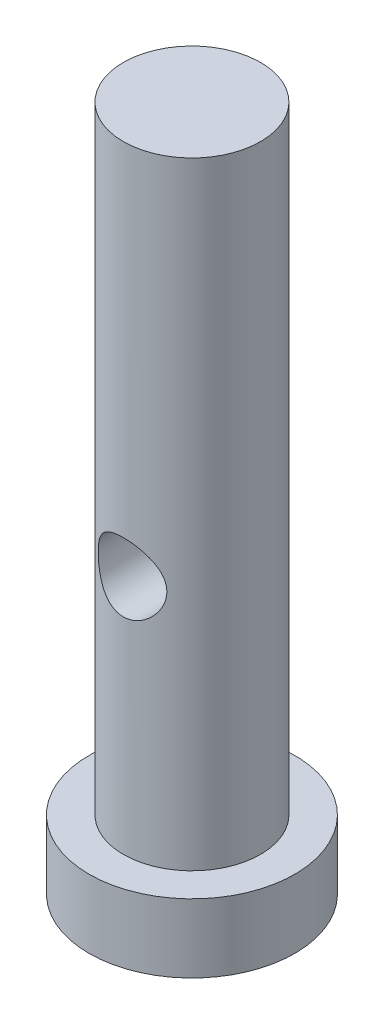
ISO-10303-21;
HEADER;
FILE_DESCRIPTION(('STEP AP214'),'2;1');
FILE_NAME('part.step','',(''),(''),'','','');
FILE_SCHEMA(('AUTOMOTIVE_DESIGN { 1 0 10303 214 1 1 1 1 }'));
ENDSEC;
DATA;
#1=APPLICATION_CONTEXT('core data for automotive mechanical design processes');
#2=APPLICATION_PROTOCOL_DEFINITION('international standard','automotive_design',2000,#1);
#3=PRODUCT_CONTEXT('',#1,'mechanical');
#4=PRODUCT('Part','Part','',(#3));
#5=PRODUCT_RELATED_PRODUCT_CATEGORY('part','',(#4));
#6=PRODUCT_DEFINITION_FORMATION('','',#4);
#7=PRODUCT_DEFINITION_CONTEXT('part definition',#1,'design');
#8=PRODUCT_DEFINITION('design','',#6,#7);
#9=PRODUCT_DEFINITION_SHAPE('','',#8);
#10=(LENGTH_UNIT() NAMED_UNIT(*) SI_UNIT(.MILLI.,.METRE.));
#11=(NAMED_UNIT(*) PLANE_ANGLE_UNIT() SI_UNIT($,.RADIAN.));
#12=(NAMED_UNIT(*) SI_UNIT($,.STERADIAN.) SOLID_ANGLE_UNIT());
#13=UNCERTAINTY_MEASURE_WITH_UNIT(LENGTH_MEASURE(1.E-05),#10,'distance_accuracy_value','');
#14=(GEOMETRIC_REPRESENTATION_CONTEXT(3) GLOBAL_UNCERTAINTY_ASSIGNED_CONTEXT((#13)) GLOBAL_UNIT_ASSIGNED_CONTEXT((#10,
#11,#12)) REPRESENTATION_CONTEXT('',''));
#15=CARTESIAN_POINT('',(0.,0.,0.));
#16=DIRECTION('',(0.,0.,1.));
#17=DIRECTION('',(1.,0.,0.));
#18=AXIS2_PLACEMENT_3D('',#15,#16,#17);
#19=CARTESIAN_POINT('',(0.,50.,0.));
#20=DIRECTION('',(0.,-1.,0.));
#21=DIRECTION('',(0.,0.,-1.));
#22=AXIS2_PLACEMENT_3D('',#19,#20,#21);
#23=CYLINDRICAL_SURFACE('',#22,5.);
#24=CARTESIAN_POINT('',(-2.5,22.5,4.33012701892219));
#25=CARTESIAN_POINT('',(-2.49998948436432,22.3697334931235,4.33013982272991));
#26=CARTESIAN_POINT('',(-2.48974954513168,22.2392972793238,4.33609541965583));
#27=CARTESIAN_POINT('',(-2.44930840724944,21.9824310284708,4.35905877051907));
#28=CARTESIAN_POINT('',(-2.41906526369545,21.8560099959427,4.37608974726023));
#29=CARTESIAN_POINT('',(-2.3402497699757,21.6113710544389,4.41873376871659));
#30=CARTESIAN_POINT('',(-2.29177485369963,21.4931134264378,4.44430111338921));
#31=CARTESIAN_POINT('',(-2.17816884056414,21.2664394369055,4.50106659111456));
#32=CARTESIAN_POINT('',(-2.11303684262671,21.1580236082042,4.53226502875883));
#33=CARTESIAN_POINT('',(-1.96166634317253,20.9442356960831,4.59992173524851));
#34=CARTESIAN_POINT('',(-1.87413008816917,20.8398521655102,4.63660159331578));
#35=CARTESIAN_POINT('',(-1.68313452122751,20.6464790242868,4.70929956727453));
#36=CARTESIAN_POINT('',(-1.57966731506051,20.5574970922451,4.74531734512768));
#37=CARTESIAN_POINT('',(-1.35122390789082,20.3915821235144,4.81553692452135));
#38=CARTESIAN_POINT('',(-1.22526797235894,20.3158655807209,4.84945266064072));
#39=CARTESIAN_POINT('',(-0.960392566671146,20.1871478665161,4.90876890230193));
#40=CARTESIAN_POINT('',(-0.821481345389982,20.1341323595615,4.93417477954535));
#41=CARTESIAN_POINT('',(-0.545112359773524,20.056238346836,4.9720115311507));
#42=CARTESIAN_POINT('',(-0.408254476210984,20.0296261841349,4.98523700553425));
#43=CARTESIAN_POINT('',(-0.131426571755678,19.9995847032887,5.00018959613973));
#44=CARTESIAN_POINT('',(0.00854151460650667,19.9961413580046,5.00192366961168));
#45=CARTESIAN_POINT('',(0.274581311061963,20.0118666849314,4.99407454791405));
#46=CARTESIAN_POINT('',(0.400802997942671,20.0290950388045,4.98546239730476));
#47=CARTESIAN_POINT('',(0.648284429795109,20.0822021097602,4.95935613149294));
#48=CARTESIAN_POINT('',(0.769543802734624,20.1180822224402,4.94186135165964));
#49=CARTESIAN_POINT('',(1.00577347892407,20.2077064152249,4.89928958219157));
#50=CARTESIAN_POINT('',(1.12063355878799,20.2616907829303,4.87411103823003));
#51=CARTESIAN_POINT('',(1.33994200378327,20.3856585405036,4.81844114966712));
#52=CARTESIAN_POINT('',(1.4443866220966,20.4556476582558,4.78794790393709));
#53=CARTESIAN_POINT('',(1.6504341522455,20.6172383788326,4.72110985998075));
#54=CARTESIAN_POINT('',(1.7508351875734,20.710257570815,4.68448439995438));
#55=CARTESIAN_POINT('',(1.93526092574444,20.9114743123254,4.61135851467029));
#56=CARTESIAN_POINT('',(2.01927302893557,21.0196834306852,4.57485820664072));
#57=CARTESIAN_POINT('',(2.17376333660553,21.2566204810602,4.50360390231212));
#58=CARTESIAN_POINT('',(2.24304328744513,21.3862150576355,4.46910799976769));
#59=CARTESIAN_POINT('',(2.35829778250308,21.6573441783975,4.4093862569644));
#60=CARTESIAN_POINT('',(2.40429664552722,21.7988660825439,4.38415075115168));
#61=CARTESIAN_POINT('',(2.4679505275626,22.078036278207,4.34861589542586));
#62=CARTESIAN_POINT('',(2.48756280529994,22.2151027976089,4.33729139621241));
#63=CARTESIAN_POINT('',(2.50379236652857,22.4910033537914,4.32794798404024));
#64=CARTESIAN_POINT('',(2.50042589328757,22.6298360727995,4.32991967223279));
#65=CARTESIAN_POINT('',(2.47259010835991,22.8891347964468,4.34585841351462));
#66=CARTESIAN_POINT('',(2.45046954178116,23.0099486277697,4.35848968766635));
#67=CARTESIAN_POINT('',(2.38924071158112,23.2459194656775,4.39235053878353));
#68=CARTESIAN_POINT('',(2.35012694655908,23.3610746268668,4.41358290012585));
#69=CARTESIAN_POINT('',(2.25411897151217,23.5885283272564,4.46340555199141));
#70=CARTESIAN_POINT('',(2.19648515923163,23.7004475421326,4.49229108107657));
#71=CARTESIAN_POINT('',(2.0657176600397,23.9136731788488,4.55390298743125));
#72=CARTESIAN_POINT('',(1.99257601083123,24.0149741087881,4.58663133387872));
#73=CARTESIAN_POINT('',(1.82209291799636,24.2174469188033,4.65719996140836));
#74=CARTESIAN_POINT('',(1.72286318078434,24.3169928767722,4.69516457885708));
#75=CARTESIAN_POINT('',(1.5085112384988,24.4985305950059,4.76835587444746));
#76=CARTESIAN_POINT('',(1.39338368664989,24.5805164256586,4.80358162519329));
#77=CARTESIAN_POINT('',(1.14633840638508,24.7264343147909,4.86853404227334));
#78=CARTESIAN_POINT('',(1.01405774389062,24.7898327952085,4.89809104179855));
#79=CARTESIAN_POINT('',(0.738805911647332,24.892844759962,4.9470838739847));
#80=CARTESIAN_POINT('',(0.595844253647067,24.9324791296051,4.96652859191746));
#81=CARTESIAN_POINT('',(0.317449205674706,24.9834214093564,4.99168770453968));
#82=CARTESIAN_POINT('',(0.182528609085377,24.9969946858303,4.99849819767838));
#83=CARTESIAN_POINT('',(-0.0878149643374301,25.0021081674946,5.00105325940467));
#84=CARTESIAN_POINT('',(-0.223237748727016,24.9936560856611,4.99680170177041));
#85=CARTESIAN_POINT('',(-0.481344982671072,24.9564589696045,4.97834922085637));
#86=CARTESIAN_POINT('',(-0.604280801321772,24.9290878283637,4.96482236636807));
#87=CARTESIAN_POINT('',(-0.843614873664454,24.8566825502417,4.92980234191731));
#88=CARTESIAN_POINT('',(-0.960012187087212,24.8116458803664,4.90830802955518));
#89=CARTESIAN_POINT('',(-1.18855854199592,24.7031821812607,4.85814826741488));
#90=CARTESIAN_POINT('',(-1.30031295715362,24.6390509753102,4.82921542506803));
#91=CARTESIAN_POINT('',(-1.51193650408535,24.4951058898524,4.76720333344986));
#92=CARTESIAN_POINT('',(-1.61180014305397,24.4152848073731,4.73412218229105));
#93=CARTESIAN_POINT('',(-1.80728542324369,24.2330042055506,4.66321523550925));
#94=CARTESIAN_POINT('',(-1.90149582349002,24.1290822739993,4.62524489658367));
#95=CARTESIAN_POINT('',(-2.07165660492503,23.9063847146178,4.55157698284941));
#96=CARTESIAN_POINT('',(-2.1475908315154,23.7875960858008,4.51588143910584));
#97=CARTESIAN_POINT('',(-2.28108393396028,23.5333638823357,4.44998982823926));
#98=CARTESIAN_POINT('',(-2.33798627977449,23.3975126115754,4.42000320346984));
#99=CARTESIAN_POINT('',(-2.40494911880459,23.1867773504802,4.38370272660094));
#100=CARTESIAN_POINT('',(-2.42419582683991,23.1154402243024,4.37305486646054));
#101=CARTESIAN_POINT('',(-2.45635087255788,22.9709593031507,4.35507574170935));
#102=CARTESIAN_POINT('',(-2.46926364179176,22.8978168090456,4.34774215854234));
#103=CARTESIAN_POINT('',(-2.48591166201423,22.7704990134531,4.33823779542921));
#104=CARTESIAN_POINT('',(-2.49118864979202,22.7165836784878,4.33520487024791));
#105=CARTESIAN_POINT('',(-2.49823512543933,22.6084553836896,4.33114674911323));
#106=CARTESIAN_POINT('',(-2.50000437866474,22.5542424041895,4.33012168747261));
#107=CARTESIAN_POINT('',(-2.5,22.5,4.33012701892219));
#108=B_SPLINE_CURVE_WITH_KNOTS('',3,(#24,#25,#26,#27,#28,#29,#30,#31,#32,#33,#34,#35,#36,#37,
#38,#39,#40,#41,#42,#43,#44,#45,#46,#47,#48,#49,#50,#51,#52,#53,#54,#55,#56,#57,#58,#59,#60,#61,
#62,#63,#64,#65,#66,#67,#68,#69,#70,#71,#72,#73,#74,#75,#76,#77,#78,#79,#80,#81,#82,#83,#84,#85,
#86,#87,#88,#89,#90,#91,#92,#93,#94,#95,#96,#97,#98,#99,#100,#101,#102,#103,#104,#105,#106,
#107),.UNSPECIFIED.,.T.,.F.,(4,2,2,2,2,2,2,2,2,2,2,2,2,2,2,2,2,2,2,2,2,2,2,2,2,2,2,2,2,2,2,2,2,
2,2,2,2,2,2,2,2,4),(0.,0.390580306486785,0.781982232062012,1.17132148982693,1.56068181366371,
1.98215578129642,2.40383927716011,2.85394730601992,3.30377067414811,3.72158712424921,
4.13915059220183,4.52040243716429,4.90168281298721,5.28823836832949,5.67493248380763,
6.09817978647309,6.5217512061988,6.97222104328704,7.42221935534345,7.83655727140612,
8.25060232976015,8.61935458565146,8.9882263109524,9.37418241020302,9.76033715555201,
10.1951685895662,10.6301466245059,11.076604535375,11.5226694952701,11.927806759788,
12.3328021699001,12.7111106218381,13.0894733378512,13.4840187680376,13.8787457525688,
14.3127560463025,14.7471485711797,15.195268726016,15.4189244153949,15.6424233996907,
15.8050484542806,15.9676843870379),.UNSPECIFIED.);
#109=CARTESIAN_POINT('',(-2.5,22.5,4.33012701892219));
#110=VERTEX_POINT('',#109);
#111=EDGE_CURVE('E52',#110,#110,#108,.T.);
#112=ORIENTED_EDGE('',*,*,#111,.F.);
#113=EDGE_LOOP('',(#112));
#114=FACE_BOUND('',#113,.T.);
#115=CARTESIAN_POINT('',(0.,50.,0.));
#116=DIRECTION('',(0.,1.,0.));
#117=DIRECTION('',(0.,0.,1.));
#118=AXIS2_PLACEMENT_3D('',#115,#116,#117);
#119=CIRCLE('',#118,5.);
#120=CARTESIAN_POINT('',(0.,50.,5.));
#121=VERTEX_POINT('',#120);
#122=EDGE_CURVE('E47',#121,#121,#119,.T.);
#123=ORIENTED_EDGE('',*,*,#122,.F.);
#124=EDGE_LOOP('',(#123));
#125=FACE_BOUND('',#124,.T.);
#126=CARTESIAN_POINT('',(0.,5.,0.));
#127=DIRECTION('',(0.,1.,0.));
#128=DIRECTION('',(0.,0.,1.));
#129=AXIS2_PLACEMENT_3D('',#126,#127,#128);
#130=CIRCLE('',#129,5.);
#131=CARTESIAN_POINT('',(0.,5.,5.));
#132=VERTEX_POINT('',#131);
#133=EDGE_CURVE('E50',#132,#132,#130,.T.);
#134=ORIENTED_EDGE('',*,*,#133,.T.);
#135=EDGE_LOOP('',(#134));
#136=FACE_BOUND('',#135,.T.);
#137=CARTESIAN_POINT('',(0.,25.,-5.));
#138=CARTESIAN_POINT('',(0.131426682334305,24.999990330944,-4.99999177550472));
#139=CARTESIAN_POINT('',(0.263015634437212,24.989574438226,-4.99476199135277));
#140=CARTESIAN_POINT('',(0.522301454622882,24.9483681788379,-4.9743541856102));
#141=CARTESIAN_POINT('',(0.649990448564105,24.917539119075,-4.9591572718767));
#142=CARTESIAN_POINT('',(0.897333631316202,24.8370153772812,-4.92040690922477));
#143=CARTESIAN_POINT('',(1.01701694536277,24.7873940122173,-4.89688595907259));
#144=CARTESIAN_POINT('',(1.24618160399671,24.6710734737482,-4.84364443325827));
#145=CARTESIAN_POINT('',(1.3556637520377,24.6043756468549,-4.81392434644421));
#146=CARTESIAN_POINT('',(1.56876952630998,24.4512068683574,-4.74890645050632));
#147=CARTESIAN_POINT('',(1.67163802294309,24.3637837997702,-4.71337997659091));
#148=CARTESIAN_POINT('',(1.86194861703333,24.1736963040147,-4.64149925776731));
#149=CARTESIAN_POINT('',(1.94937895911555,24.0710203711599,-4.60514440566897));
#150=CARTESIAN_POINT('',(2.11312999967247,23.8437916255547,-4.53247377945622));
#151=CARTESIAN_POINT('',(2.18806333849064,23.718159753965,-4.49637967412567));
#152=CARTESIAN_POINT('',(2.31542056761491,23.4540816602046,-4.43214946943555));
#153=CARTESIAN_POINT('',(2.36786053751682,23.3156446782374,-4.40400769020792));
#154=CARTESIAN_POINT('',(2.44533110537653,23.0383372364036,-4.36144667591402));
#155=CARTESIAN_POINT('',(2.47181464267578,22.8999888698204,-4.34630678958452));
#156=CARTESIAN_POINT('',(2.50106748329741,22.6200529055624,-4.3295472487215));
#157=CARTESIAN_POINT('',(2.50386022093906,22.4784686478249,-4.3279142335843));
#158=CARTESIAN_POINT('',(2.48671821792512,22.2142849392091,-4.33777325642937));
#159=CARTESIAN_POINT('',(2.46946139884055,22.0914399219417,-4.34771909154984));
#160=CARTESIAN_POINT('',(2.41734962264384,21.8506952265681,-4.37690571834675));
#161=CARTESIAN_POINT('',(2.38248905974454,21.7327971367369,-4.39614947079454));
#162=CARTESIAN_POINT('',(2.29552445096459,21.5019271685857,-4.44218691031839));
#163=CARTESIAN_POINT('',(2.24303766778988,21.3891340030355,-4.46914601659993));
#164=CARTESIAN_POINT('',(2.12260421917012,21.173414268525,-4.52758510703513));
#165=CARTESIAN_POINT('',(2.0546506095312,21.0704921609998,-4.55906711950477));
#166=CARTESIAN_POINT('',(1.89516513728194,20.8636968681419,-4.62782894758213));
#167=CARTESIAN_POINT('',(1.80173614592319,20.7613578160596,-4.66533775591865));
#168=CARTESIAN_POINT('',(1.59888894685344,20.5731614535228,-4.73869058251019));
#169=CARTESIAN_POINT('',(1.48946314143571,20.4873120199153,-4.77453379897003));
#170=CARTESIAN_POINT('',(1.25129126457962,20.3307858474257,-4.84254968207409));
#171=CARTESIAN_POINT('',(1.12188397899853,20.2609988188856,-4.87447460405015));
#172=CARTESIAN_POINT('',(0.851165538721984,20.1447574273925,-4.92894702803109));
#173=CARTESIAN_POINT('',(0.709863940663162,20.0982845374621,-4.95150197358893));
#174=CARTESIAN_POINT('',(0.431916229151782,20.0338114907083,-4.98310834353579));
#175=CARTESIAN_POINT('',(0.295853826370907,20.013771910633,-4.9931234575324));
#176=CARTESIAN_POINT('',(0.021948999873289,19.9963381721638,-5.00182533647794));
#177=CARTESIAN_POINT('',(-0.115892549675108,19.9989332859015,-5.00051746803426));
#178=CARTESIAN_POINT('',(-0.378082429964655,20.0255167210467,-4.98727980633468));
#179=CARTESIAN_POINT('',(-0.502648520123706,20.0478313318244,-4.97618114219992));
#180=CARTESIAN_POINT('',(-0.746017230755972,20.1105951797384,-4.94555428287529));
#181=CARTESIAN_POINT('',(-0.864819214231883,20.1510464161359,-4.92602515837625));
#182=CARTESIAN_POINT('',(-1.09722152111965,20.2499961660804,-4.87960628532329));
#183=CARTESIAN_POINT('',(-1.21057599249831,20.3089776252823,-4.85252204417873));
#184=CARTESIAN_POINT('',(-1.42615340426439,20.4427688391248,-4.7935993579975));
#185=CARTESIAN_POINT('',(-1.52837157450203,20.5175853365199,-4.76175888940534));
#186=CARTESIAN_POINT('',(-1.72941922315487,20.6894010632909,-4.69270553315087));
#187=CARTESIAN_POINT('',(-1.82693019428496,20.7878571709752,-4.65527212009488));
#188=CARTESIAN_POINT('',(-2.0046408025722,20.9998128780494,-4.58155978921587));
#189=CARTESIAN_POINT('',(-2.08482846428685,21.1133227970699,-4.54528168472407));
#190=CARTESIAN_POINT('',(-2.22926978618995,21.3591091354847,-4.4762798054528));
#191=CARTESIAN_POINT('',(-2.29256373922243,21.4920281652911,-4.44381323981254));
#192=CARTESIAN_POINT('',(-2.39520706511459,21.7687751688826,-4.38935180726746));
#193=CARTESIAN_POINT('',(-2.43458729077055,21.912588816,-4.36734345549014));
#194=CARTESIAN_POINT('',(-2.48465421767005,22.1922755573629,-4.33903752569351));
#195=CARTESIAN_POINT('',(-2.4977324874436,22.327585634119,-4.33143458674096));
#196=CARTESIAN_POINT('',(-2.50172288950898,22.5986176673807,-4.32913386592579));
#197=CARTESIAN_POINT('',(-2.49264462983266,22.7343394198736,-4.33443049025111));
#198=CARTESIAN_POINT('',(-2.45481530197332,22.9887087556169,-4.35594655164663));
#199=CARTESIAN_POINT('',(-2.42802074302696,23.1077511817208,-4.37107736338133));
#200=CARTESIAN_POINT('',(-2.35793843840544,23.3395202922,-4.40927540337602));
#201=CARTESIAN_POINT('',(-2.31464538728732,23.4522449315665,-4.43234518434965));
#202=CARTESIAN_POINT('',(-2.20953919315538,23.6765621527197,-4.48571326433413));
#203=CARTESIAN_POINT('',(-2.14667719009403,23.787569851735,-4.5163930799845));
#204=CARTESIAN_POINT('',(-2.0053780838799,23.99818624324,-4.58088327077455));
#205=CARTESIAN_POINT('',(-1.92693287765888,24.0977889626287,-4.61469526970767));
#206=CARTESIAN_POINT('',(-1.74550556946066,24.2953553637496,-4.68655816327011));
#207=CARTESIAN_POINT('',(-1.6407002246921,24.3916493641714,-4.7246249151498));
#208=CARTESIAN_POINT('',(-1.41539785420684,24.565655849428,-4.79694347383545));
#209=CARTESIAN_POINT('',(-1.29489242426332,24.6433583186059,-4.83119321905446));
#210=CARTESIAN_POINT('',(-1.03978808878537,24.7780969794841,-4.89245149457782));
#211=CARTESIAN_POINT('',(-0.905095560782291,24.8349831677845,-4.91940711437488));
#212=CARTESIAN_POINT('',(-0.696328709257353,24.9021838587924,-4.95177960923351));
#213=CARTESIAN_POINT('',(-0.625670413494089,24.9215553980018,-4.96122314081874));
#214=CARTESIAN_POINT('',(-0.482623997839257,24.9540659483706,-4.97717127275101));
#215=CARTESIAN_POINT('',(-0.410236963092401,24.9672087666764,-4.98367766823159));
#216=CARTESIAN_POINT('',(-0.281518684621671,24.9847374722846,-4.9923820076613));
#217=CARTESIAN_POINT('',(-0.225408499555444,24.9904549365313,-4.99523288466454));
#218=CARTESIAN_POINT('',(-0.112875528456289,24.9980883294657,-4.99904367329659));
#219=CARTESIAN_POINT('',(-0.0564527338382178,25.0000041532255,-5.00000353273198));
#220=CARTESIAN_POINT('',(0.,25.,-5.));
#221=B_SPLINE_CURVE_WITH_KNOTS('',3,(#137,#138,#139,#140,#141,#142,#143,#144,#145,#146,#147,
#148,#149,#150,#151,#152,#153,#154,#155,#156,#157,#158,#159,#160,#161,#162,#163,#164,#165,#166,
#167,#168,#169,#170,#171,#172,#173,#174,#175,#176,#177,#178,#179,#180,#181,#182,#183,#184,#185,
#186,#187,#188,#189,#190,#191,#192,#193,#194,#195,#196,#197,#198,#199,#200,#201,#202,#203,#204,
#205,#206,#207,#208,#209,#210,#211,#212,#213,#214,#215,#216,#217,#218,#219,#220),.UNSPECIFIED.,
.T.,.F.,(4,2,2,2,2,2,2,2,2,2,2,2,2,2,2,2,2,2,2,2,2,2,2,2,2,2,2,2,2,2,2,2,2,2,2,2,2,2,2,2,2,4),
(0.,0.394060643550731,0.788870374272993,1.18215538873074,1.57540940145392,1.99245439679523,
2.40981559413509,2.85954316076882,3.30894869745703,3.73145030350574,4.15353393322551,
4.52514281023301,4.89687009814196,5.27725600421218,5.65781303150554,6.08662353334696,
6.51563836496716,6.96457555536102,7.41315542280699,7.82458226178364,8.2358141127869,
8.61517266265305,8.99457304077329,9.38482140069746,9.77523626870848,10.2039902661037,
10.6330397153795,11.0828670540368,11.53211279863,11.9382326875698,12.3441764966106,
12.7114482562151,13.0788382197025,13.4709114195009,13.8631890285845,14.303131068923,
14.7433095845248,15.1866003415818,15.407934939208,15.6291340766843,15.7983933645035,
15.9676573239322),.UNSPECIFIED.);
#222=CARTESIAN_POINT('',(0.,25.,-5.));
#223=VERTEX_POINT('',#222);
#224=EDGE_CURVE('E34',#223,#223,#221,.T.);
#225=ORIENTED_EDGE('',*,*,#224,.F.);
#226=EDGE_LOOP('',(#225));
#227=FACE_BOUND('',#226,.T.);
#228=ADVANCED_FACE('F30',(#114,#125,#136,#227),#23,.T.);
#229=CARTESIAN_POINT('',(0.,5.,0.));
#230=DIRECTION('',(0.,1.,0.));
#231=DIRECTION('',(0.,0.,1.));
#232=AXIS2_PLACEMENT_3D('',#229,#230,#231);
#233=PLANE('',#232);
#234=CARTESIAN_POINT('',(0.,5.,0.));
#235=DIRECTION('',(0.,1.,0.));
#236=DIRECTION('',(0.,0.,1.));
#237=AXIS2_PLACEMENT_3D('',#234,#235,#236);
#238=CIRCLE('',#237,7.5);
#239=CARTESIAN_POINT('',(0.,5.,7.5));
#240=VERTEX_POINT('',#239);
#241=EDGE_CURVE('E10',#240,#240,#238,.T.);
#242=ORIENTED_EDGE('',*,*,#241,.T.);
#243=EDGE_LOOP('',(#242));
#244=FACE_BOUND('',#243,.T.);
#245=ORIENTED_EDGE('',*,*,#133,.F.);
#246=EDGE_LOOP('',(#245));
#247=FACE_BOUND('',#246,.T.);
#248=ADVANCED_FACE('F75',(#244,#247),#233,.T.);
#249=CARTESIAN_POINT('',(0.,5.,0.));
#250=DIRECTION('',(0.,-1.,0.));
#251=DIRECTION('',(0.,0.,-1.));
#252=AXIS2_PLACEMENT_3D('',#249,#250,#251);
#253=CYLINDRICAL_SURFACE('',#252,7.5);
#254=ORIENTED_EDGE('',*,*,#241,.F.);
#255=EDGE_LOOP('',(#254));
#256=FACE_BOUND('',#255,.T.);
#257=CARTESIAN_POINT('',(0.,0.,0.));
#258=DIRECTION('',(0.,1.,0.));
#259=DIRECTION('',(0.,0.,1.));
#260=AXIS2_PLACEMENT_3D('',#257,#258,#259);
#261=CIRCLE('',#260,7.5);
#262=CARTESIAN_POINT('',(0.,0.,7.5));
#263=VERTEX_POINT('',#262);
#264=EDGE_CURVE('E42',#263,#263,#261,.T.);
#265=ORIENTED_EDGE('',*,*,#264,.T.);
#266=EDGE_LOOP('',(#265));
#267=FACE_BOUND('',#266,.T.);
#268=ADVANCED_FACE('F32',(#256,#267),#253,.T.);
#269=CARTESIAN_POINT('',(0.,0.,0.));
#270=DIRECTION('',(0.,1.,0.));
#271=DIRECTION('',(0.,0.,1.));
#272=AXIS2_PLACEMENT_3D('',#269,#270,#271);
#273=PLANE('',#272);
#274=ORIENTED_EDGE('',*,*,#264,.F.);
#275=EDGE_LOOP('',(#274));
#276=FACE_BOUND('',#275,.T.);
#277=ADVANCED_FACE('F66',(#276),#273,.F.);
#278=CARTESIAN_POINT('',(0.,50.,0.));
#279=DIRECTION('',(0.,1.,0.));
#280=DIRECTION('',(0.,0.,1.));
#281=AXIS2_PLACEMENT_3D('',#278,#279,#280);
#282=PLANE('',#281);
#283=ORIENTED_EDGE('',*,*,#122,.T.);
#284=EDGE_LOOP('',(#283));
#285=FACE_BOUND('',#284,.T.);
#286=ADVANCED_FACE('F62',(#285),#282,.T.);
#287=CARTESIAN_POINT('',(0.,22.5,25.));
#288=DIRECTION('',(0.,0.,-1.));
#289=DIRECTION('',(-1.,0.,0.));
#290=AXIS2_PLACEMENT_3D('',#287,#288,#289);
#291=CYLINDRICAL_SURFACE('',#290,2.5);
#292=ORIENTED_EDGE('',*,*,#111,.T.);
#293=EDGE_LOOP('',(#292));
#294=FACE_BOUND('',#293,.T.);
#295=ORIENTED_EDGE('',*,*,#224,.T.);
#296=EDGE_LOOP('',(#295));
#297=FACE_BOUND('',#296,.T.);
#298=ADVANCED_FACE('F59',(#294,#297),#291,.F.);
#299=CLOSED_SHELL('',(#228,#248,#268,#277,#286,#298));
#300=MANIFOLD_SOLID_BREP('B2',#299);
#301=ADVANCED_BREP_SHAPE_REPRESENTATION('',(#18,#300),#14);
#302=SHAPE_DEFINITION_REPRESENTATION(#9,#301);
ENDSEC;
END-ISO-10303-21;
